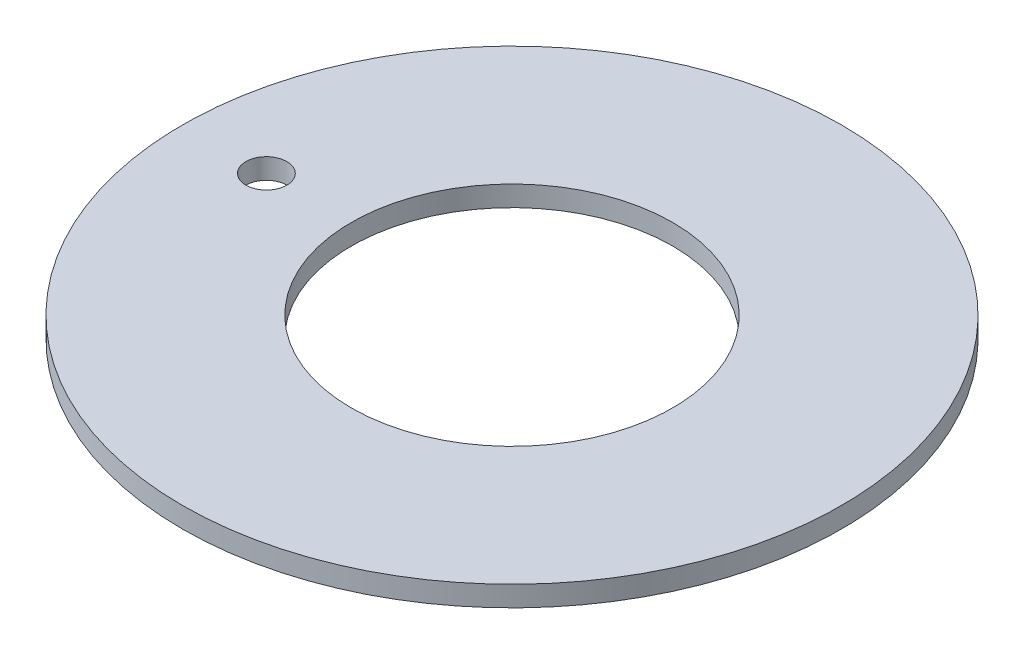
ISO-10303-21;
HEADER;
FILE_DESCRIPTION(('STEP AP214'),'2;1');
FILE_NAME('part.step','',(''),(''),'','','');
FILE_SCHEMA(('AUTOMOTIVE_DESIGN { 1 0 10303 214 1 1 1 1 }'));
ENDSEC;
DATA;
#1=APPLICATION_CONTEXT('core data for automotive mechanical design processes');
#2=APPLICATION_PROTOCOL_DEFINITION('international standard','automotive_design',2000,#1);
#3=PRODUCT_CONTEXT('',#1,'mechanical');
#4=PRODUCT('Part','Part','',(#3));
#5=PRODUCT_RELATED_PRODUCT_CATEGORY('part','',(#4));
#6=PRODUCT_DEFINITION_FORMATION('','',#4);
#7=PRODUCT_DEFINITION_CONTEXT('part definition',#1,'design');
#8=PRODUCT_DEFINITION('design','',#6,#7);
#9=PRODUCT_DEFINITION_SHAPE('','',#8);
#10=(LENGTH_UNIT() NAMED_UNIT(*) SI_UNIT(.MILLI.,.METRE.));
#11=(NAMED_UNIT(*) PLANE_ANGLE_UNIT() SI_UNIT($,.RADIAN.));
#12=(NAMED_UNIT(*) SI_UNIT($,.STERADIAN.) SOLID_ANGLE_UNIT());
#13=UNCERTAINTY_MEASURE_WITH_UNIT(LENGTH_MEASURE(1.E-05),#10,'distance_accuracy_value','');
#14=(GEOMETRIC_REPRESENTATION_CONTEXT(3) GLOBAL_UNCERTAINTY_ASSIGNED_CONTEXT((#13)) GLOBAL_UNIT_ASSIGNED_CONTEXT((#10,
#11,#12)) REPRESENTATION_CONTEXT('',''));
#15=CARTESIAN_POINT('',(0.,0.,0.));
#16=DIRECTION('',(0.,0.,1.));
#17=DIRECTION('',(1.,0.,0.));
#18=AXIS2_PLACEMENT_3D('',#15,#16,#17);
#19=CARTESIAN_POINT('',(0.,2.,0.));
#20=DIRECTION('',(0.,1.,0.));
#21=DIRECTION('',(0.,0.,1.));
#22=AXIS2_PLACEMENT_3D('',#19,#20,#21);
#23=PLANE('',#22);
#24=CARTESIAN_POINT('',(-24.,2.,0.));
#25=DIRECTION('',(0.,1.,0.));
#26=DIRECTION('',(0.,0.,1.));
#27=AXIS2_PLACEMENT_3D('',#24,#25,#26);
#28=CIRCLE('',#27,2.);
#29=CARTESIAN_POINT('',(-24.,2.,2.));
#30=VERTEX_POINT('',#29);
#31=EDGE_CURVE('E50',#30,#30,#28,.T.);
#32=ORIENTED_EDGE('',*,*,#31,.F.);
#33=EDGE_LOOP('',(#32));
#34=FACE_BOUND('',#33,.T.);
#35=CARTESIAN_POINT('',(0.,2.,0.));
#36=DIRECTION('',(0.,1.,0.));
#37=DIRECTION('',(0.,0.,1.));
#38=AXIS2_PLACEMENT_3D('',#35,#36,#37);
#39=CIRCLE('',#38,32.2);
#40=CARTESIAN_POINT('',(0.,2.,32.2));
#41=VERTEX_POINT('',#40);
#42=EDGE_CURVE('E10',#41,#41,#39,.T.);
#43=ORIENTED_EDGE('',*,*,#42,.T.);
#44=EDGE_LOOP('',(#43));
#45=FACE_BOUND('',#44,.T.);
#46=CARTESIAN_POINT('',(0.,2.,0.));
#47=DIRECTION('',(0.,1.,0.));
#48=DIRECTION('',(0.,0.,1.));
#49=AXIS2_PLACEMENT_3D('',#46,#47,#48);
#50=CIRCLE('',#49,15.7);
#51=CARTESIAN_POINT('',(0.,2.,15.7));
#52=VERTEX_POINT('',#51);
#53=EDGE_CURVE('E42',#52,#52,#50,.T.);
#54=ORIENTED_EDGE('',*,*,#53,.F.);
#55=EDGE_LOOP('',(#54));
#56=FACE_BOUND('',#55,.T.);
#57=ADVANCED_FACE('F31',(#34,#45,#56),#23,.T.);
#58=CARTESIAN_POINT('',(0.,0.,0.));
#59=DIRECTION('',(0.,1.,0.));
#60=DIRECTION('',(0.,0.,1.));
#61=AXIS2_PLACEMENT_3D('',#58,#59,#60);
#62=PLANE('',#61);
#63=CARTESIAN_POINT('',(-24.,0.,0.));
#64=DIRECTION('',(0.,1.,0.));
#65=DIRECTION('',(0.,0.,1.));
#66=AXIS2_PLACEMENT_3D('',#63,#64,#65);
#67=CIRCLE('',#66,2.);
#68=CARTESIAN_POINT('',(-24.,0.,2.));
#69=VERTEX_POINT('',#68);
#70=EDGE_CURVE('E47',#69,#69,#67,.T.);
#71=ORIENTED_EDGE('',*,*,#70,.T.);
#72=EDGE_LOOP('',(#71));
#73=FACE_BOUND('',#72,.T.);
#74=CARTESIAN_POINT('',(0.,0.,0.));
#75=DIRECTION('',(0.,1.,0.));
#76=DIRECTION('',(0.,0.,1.));
#77=AXIS2_PLACEMENT_3D('',#74,#75,#76);
#78=CIRCLE('',#77,32.2);
#79=CARTESIAN_POINT('',(0.,0.,32.2));
#80=VERTEX_POINT('',#79);
#81=EDGE_CURVE('E35',#80,#80,#78,.T.);
#82=ORIENTED_EDGE('',*,*,#81,.F.);
#83=EDGE_LOOP('',(#82));
#84=FACE_BOUND('',#83,.T.);
#85=CARTESIAN_POINT('',(0.,0.,0.));
#86=DIRECTION('',(0.,1.,0.));
#87=DIRECTION('',(0.,0.,1.));
#88=AXIS2_PLACEMENT_3D('',#85,#86,#87);
#89=CIRCLE('',#88,15.7);
#90=CARTESIAN_POINT('',(0.,0.,15.7));
#91=VERTEX_POINT('',#90);
#92=EDGE_CURVE('E44',#91,#91,#89,.T.);
#93=ORIENTED_EDGE('',*,*,#92,.T.);
#94=EDGE_LOOP('',(#93));
#95=FACE_BOUND('',#94,.T.);
#96=ADVANCED_FACE('F56',(#73,#84,#95),#62,.F.);
#97=CARTESIAN_POINT('',(0.,2.,0.));
#98=DIRECTION('',(0.,-1.,0.));
#99=DIRECTION('',(0.,0.,-1.));
#100=AXIS2_PLACEMENT_3D('',#97,#98,#99);
#101=CYLINDRICAL_SURFACE('',#100,32.2);
#102=ORIENTED_EDGE('',*,*,#42,.F.);
#103=EDGE_LOOP('',(#102));
#104=FACE_BOUND('',#103,.T.);
#105=ORIENTED_EDGE('',*,*,#81,.T.);
#106=EDGE_LOOP('',(#105));
#107=FACE_BOUND('',#106,.T.);
#108=ADVANCED_FACE('F33',(#104,#107),#101,.T.);
#109=CARTESIAN_POINT('',(0.,2.,0.));
#110=DIRECTION('',(0.,-1.,0.));
#111=DIRECTION('',(0.,0.,-1.));
#112=AXIS2_PLACEMENT_3D('',#109,#110,#111);
#113=CYLINDRICAL_SURFACE('',#112,15.7);
#114=ORIENTED_EDGE('',*,*,#53,.T.);
#115=EDGE_LOOP('',(#114));
#116=FACE_BOUND('',#115,.T.);
#117=ORIENTED_EDGE('',*,*,#92,.F.);
#118=EDGE_LOOP('',(#117));
#119=FACE_BOUND('',#118,.T.);
#120=ADVANCED_FACE('F62',(#116,#119),#113,.F.);
#121=CARTESIAN_POINT('',(-24.,0.,0.));
#122=DIRECTION('',(0.,1.,0.));
#123=DIRECTION('',(0.,0.,1.));
#124=AXIS2_PLACEMENT_3D('',#121,#122,#123);
#125=CYLINDRICAL_SURFACE('',#124,2.);
#126=ORIENTED_EDGE('',*,*,#70,.F.);
#127=EDGE_LOOP('',(#126));
#128=FACE_BOUND('',#127,.T.);
#129=ORIENTED_EDGE('',*,*,#31,.T.);
#130=EDGE_LOOP('',(#129));
#131=FACE_BOUND('',#130,.T.);
#132=ADVANCED_FACE('F59',(#128,#131),#125,.F.);
#133=CLOSED_SHELL('',(#57,#96,#108,#120,#132));
#134=MANIFOLD_SOLID_BREP('B2',#133);
#135=ADVANCED_BREP_SHAPE_REPRESENTATION('',(#18,#134),#14);
#136=SHAPE_DEFINITION_REPRESENTATION(#9,#135);
ENDSEC;
END-ISO-10303-21;
